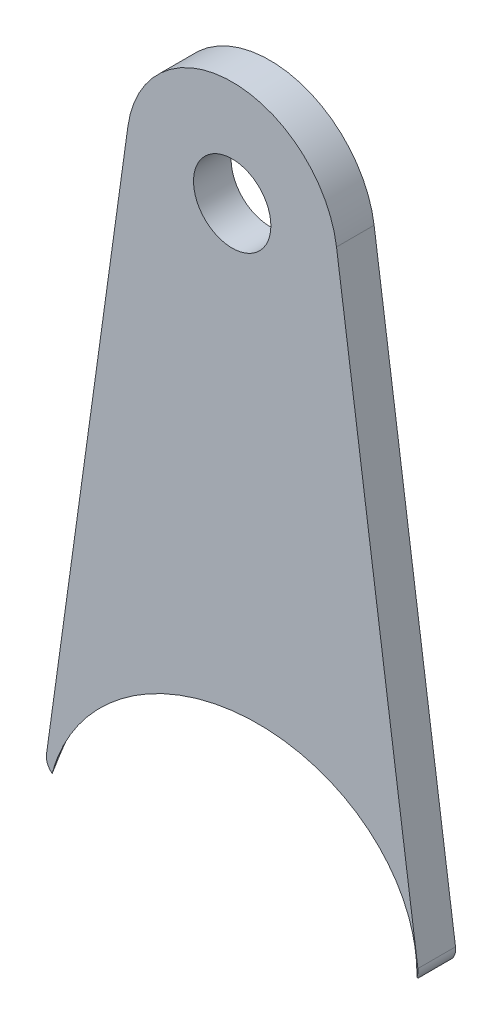
ISO-10303-21;
HEADER;
FILE_DESCRIPTION(('STEP AP214'),'2;1');
FILE_NAME('part.step','',(''),(''),'','','');
FILE_SCHEMA(('AUTOMOTIVE_DESIGN { 1 0 10303 214 1 1 1 1 }'));
ENDSEC;
DATA;
#1=APPLICATION_CONTEXT('core data for automotive mechanical design processes');
#2=APPLICATION_PROTOCOL_DEFINITION('international standard','automotive_design',2000,#1);
#3=PRODUCT_CONTEXT('',#1,'mechanical');
#4=PRODUCT('Part','Part','',(#3));
#5=PRODUCT_RELATED_PRODUCT_CATEGORY('part','',(#4));
#6=PRODUCT_DEFINITION_FORMATION('','',#4);
#7=PRODUCT_DEFINITION_CONTEXT('part definition',#1,'design');
#8=PRODUCT_DEFINITION('design','',#6,#7);
#9=PRODUCT_DEFINITION_SHAPE('','',#8);
#10=(LENGTH_UNIT() NAMED_UNIT(*) SI_UNIT(.MILLI.,.METRE.));
#11=(NAMED_UNIT(*) PLANE_ANGLE_UNIT() SI_UNIT($,.RADIAN.));
#12=(NAMED_UNIT(*) SI_UNIT($,.STERADIAN.) SOLID_ANGLE_UNIT());
#13=UNCERTAINTY_MEASURE_WITH_UNIT(LENGTH_MEASURE(1.E-05),#10,'distance_accuracy_value','');
#14=(GEOMETRIC_REPRESENTATION_CONTEXT(3) GLOBAL_UNCERTAINTY_ASSIGNED_CONTEXT((#13)) GLOBAL_UNIT_ASSIGNED_CONTEXT((#10,
#11,#12)) REPRESENTATION_CONTEXT('',''));
#15=CARTESIAN_POINT('',(0.,0.,0.));
#16=DIRECTION('',(0.,0.,1.));
#17=DIRECTION('',(1.,0.,0.));
#18=AXIS2_PLACEMENT_3D('',#15,#16,#17);
#19=CARTESIAN_POINT('',(0.,-49.53,-3.175));
#20=DIRECTION('',(0.,1.,0.));
#21=DIRECTION('',(-1.,0.,0.));
#22=AXIS2_PLACEMENT_3D('',#19,#20,#21);
#23=PLANE('',#22);
#24=CARTESIAN_POINT('',(2.2994860629505,-49.53,3.53926844532537));
#25=DIRECTION('',(0.,-1.,0.));
#26=DIRECTION('',(0.544815380436228,0.,0.838556021527559));
#27=AXIS2_PLACEMENT_3D('',#24,#25,#26);
#28=ELLIPSE('',#27,60.3015967233952,13.081);
#29=CARTESIAN_POINT('',(14.4158368159501,-49.53,-1.80692645308177));
#30=VERTEX_POINT('',#29);
#31=CARTESIAN_POINT('',(13.5360980076692,-49.53,-3.175));
#32=VERTEX_POINT('',#31);
#33=EDGE_CURVE('E152',#30,#32,#28,.F.);
#34=ORIENTED_EDGE('',*,*,#33,.T.);
#35=DIRECTION('',(1.,0.,0.));
#36=VECTOR('',#35,1.);
#37=CARTESIAN_POINT('',(0.,-49.53,-3.175));
#38=LINE('',#37,#36);
#39=CARTESIAN_POINT('',(14.4158368159501,-49.53,-3.175));
#40=VERTEX_POINT('',#39);
#41=EDGE_CURVE('E146',#32,#40,#38,.T.);
#42=ORIENTED_EDGE('',*,*,#41,.T.);
#43=DIRECTION('',(0.,0.,1.));
#44=VECTOR('',#43,1.);
#45=CARTESIAN_POINT('',(14.4158368159501,-49.53,-3.175));
#46=LINE('',#45,#44);
#47=EDGE_CURVE('E200',#30,#40,#46,.F.);
#48=ORIENTED_EDGE('',*,*,#47,.F.);
#49=EDGE_LOOP('',(#34,#42,#48));
#50=FACE_BOUND('',#49,.T.);
#51=ADVANCED_FACE('F45',(#50),#23,.F.);
#52=CARTESIAN_POINT('',(-8.80499106591057,1.22647149548415,-3.175));
#53=DIRECTION('',(-0.990437690203663,0.137960798142199,0.));
#54=DIRECTION('',(-0.1379607981422,-0.990437690203663,0.));
#55=AXIS2_PLACEMENT_3D('',#52,#53,#54);
#56=PLANE('',#55);
#57=DIRECTION('',(0.1379607981422,0.990437690203663,0.));
#58=VECTOR('',#57,1.);
#59=CARTESIAN_POINT('',(-8.80499106591057,1.22647149548415,0.));
#60=LINE('',#59,#58);
#61=CARTESIAN_POINT('',(-15.6736926825088,-48.0847897863594,0.));
#62=VERTEX_POINT('',#61);
#63=CARTESIAN_POINT('',(-8.80499106591057,1.22647149548415,0.));
#64=VERTEX_POINT('',#63);
#65=EDGE_CURVE('E111',#62,#64,#60,.T.);
#66=ORIENTED_EDGE('',*,*,#65,.T.);
#67=DIRECTION('',(0.,0.,1.));
#68=VECTOR('',#67,1.);
#69=CARTESIAN_POINT('',(-8.80499106591057,1.22647149548415,-3.175));
#70=LINE('',#69,#68);
#71=CARTESIAN_POINT('',(-8.80499106591057,1.22647149548415,-3.175));
#72=VERTEX_POINT('',#71);
#73=EDGE_CURVE('E120',#72,#64,#70,.T.);
#74=ORIENTED_EDGE('',*,*,#73,.F.);
#75=DIRECTION('',(0.1379607981422,0.990437690203663,0.));
#76=VECTOR('',#75,1.);
#77=CARTESIAN_POINT('',(-8.80499106591057,1.22647149548415,-3.175));
#78=LINE('',#77,#76);
#79=CARTESIAN_POINT('',(-15.3741347869044,-45.9342264799712,-3.175));
#80=VERTEX_POINT('',#79);
#81=EDGE_CURVE('E126',#80,#72,#78,.T.);
#82=ORIENTED_EDGE('',*,*,#81,.F.);
#83=CARTESIAN_POINT('',(-16.969769766165,-57.3894880075109,-26.1191279327687));
#84=DIRECTION('',(0.990437690203663,-0.137960798142199,0.));
#85=DIRECTION('',(0.045818832446097,0.328939084050282,0.943238948293293));
#86=AXIS2_PLACEMENT_3D('',#83,#84,#85);
#87=ELLIPSE('',#86,26.328963966994,13.081);
#88=CARTESIAN_POINT('',(-15.6736926825087,-48.0847897863594,-1.5539090575443));
#89=VERTEX_POINT('',#88);
#90=EDGE_CURVE('E148',#89,#80,#87,.F.);
#91=ORIENTED_EDGE('',*,*,#90,.F.);
#92=DIRECTION('',(0.,0.,1.));
#93=VECTOR('',#92,1.);
#94=CARTESIAN_POINT('',(-15.6736926825088,-48.0847897863594,-1.0572225503932));
#95=LINE('',#94,#93);
#96=EDGE_CURVE('E11',#62,#89,#95,.F.);
#97=ORIENTED_EDGE('',*,*,#96,.F.);
#98=EDGE_LOOP('',(#66,#74,#82,#91,#97));
#99=FACE_BOUND('',#98,.T.);
#100=ADVANCED_FACE('F129',(#99),#56,.T.);
#101=CARTESIAN_POINT('',(8.80499106591057,1.22647149548416,-3.175));
#102=DIRECTION('',(-0.990437690203663,-0.1379607981422,0.));
#103=DIRECTION('',(0.1379607981422,-0.990437690203663,0.));
#104=AXIS2_PLACEMENT_3D('',#101,#102,#103);
#105=PLANE('',#104);
#106=DIRECTION('',(-0.1379607981422,0.990437690203663,0.));
#107=VECTOR('',#106,1.);
#108=CARTESIAN_POINT('',(8.80499106591057,1.22647149548416,-3.175));
#109=LINE('',#108,#107);
#110=CARTESIAN_POINT('',(15.6736926825088,-48.0847897863594,-3.175));
#111=VERTEX_POINT('',#110);
#112=CARTESIAN_POINT('',(8.80499106591057,1.22647149548416,-3.175));
#113=VERTEX_POINT('',#112);
#114=EDGE_CURVE('E136',#111,#113,#109,.T.);
#115=ORIENTED_EDGE('',*,*,#114,.T.);
#116=DIRECTION('',(0.,0.,1.));
#117=VECTOR('',#116,1.);
#118=CARTESIAN_POINT('',(8.80499106591057,1.22647149548416,-3.175));
#119=LINE('',#118,#117);
#120=CARTESIAN_POINT('',(8.80499106591057,1.22647149548416,0.));
#121=VERTEX_POINT('',#120);
#122=EDGE_CURVE('E117',#113,#121,#119,.T.);
#123=ORIENTED_EDGE('',*,*,#122,.T.);
#124=DIRECTION('',(-0.1379607981422,0.990437690203663,0.));
#125=VECTOR('',#124,1.);
#126=CARTESIAN_POINT('',(8.80499106591057,1.22647149548416,0.));
#127=LINE('',#126,#125);
#128=CARTESIAN_POINT('',(15.6736926825088,-48.0847897863594,0.));
#129=VERTEX_POINT('',#128);
#130=EDGE_CURVE('E113',#129,#121,#127,.T.);
#131=ORIENTED_EDGE('',*,*,#130,.F.);
#132=DIRECTION('',(0.,0.,1.));
#133=VECTOR('',#132,1.);
#134=CARTESIAN_POINT('',(15.6736926825088,-48.0847897863594,-3.175));
#135=LINE('',#134,#133);
#136=EDGE_CURVE('E155',#111,#129,#135,.T.);
#137=ORIENTED_EDGE('',*,*,#136,.F.);
#138=EDGE_LOOP('',(#115,#123,#131,#137));
#139=FACE_BOUND('',#138,.T.);
#140=ADVANCED_FACE('F202',(#139),#105,.F.);
#141=CARTESIAN_POINT('',(0.,0.,-3.175));
#142=DIRECTION('',(0.,0.,1.));
#143=DIRECTION('',(-1.,0.,0.));
#144=AXIS2_PLACEMENT_3D('',#141,#142,#143);
#145=CYLINDRICAL_SURFACE('',#144,8.89);
#146=CARTESIAN_POINT('',(0.,0.,0.));
#147=DIRECTION('',(0.,0.,1.));
#148=DIRECTION('',(1.,0.,0.));
#149=AXIS2_PLACEMENT_3D('',#146,#147,#148);
#150=CIRCLE('',#149,8.89);
#151=EDGE_CURVE('E105',#121,#64,#150,.T.);
#152=ORIENTED_EDGE('',*,*,#151,.F.);
#153=ORIENTED_EDGE('',*,*,#122,.F.);
#154=CARTESIAN_POINT('',(0.,0.,-3.175));
#155=DIRECTION('',(0.,0.,1.));
#156=DIRECTION('',(1.,0.,0.));
#157=AXIS2_PLACEMENT_3D('',#154,#155,#156);
#158=CIRCLE('',#157,8.89);
#159=EDGE_CURVE('E122',#113,#72,#158,.T.);
#160=ORIENTED_EDGE('',*,*,#159,.T.);
#161=ORIENTED_EDGE('',*,*,#73,.T.);
#162=EDGE_LOOP('',(#152,#153,#160,#161));
#163=FACE_BOUND('',#162,.T.);
#164=ADVANCED_FACE('F121',(#163),#145,.T.);
#165=CARTESIAN_POINT('',(0.,0.,-3.175));
#166=DIRECTION('',(0.,0.,1.));
#167=DIRECTION('',(-1.,0.,0.));
#168=AXIS2_PLACEMENT_3D('',#165,#166,#167);
#169=CYLINDRICAL_SURFACE('',#168,3.2639);
#170=CARTESIAN_POINT('',(0.,0.,-3.175));
#171=DIRECTION('',(0.,0.,1.));
#172=DIRECTION('',(1.,0.,0.));
#173=AXIS2_PLACEMENT_3D('',#170,#171,#172);
#174=CIRCLE('',#173,3.2639);
#175=CARTESIAN_POINT('',(3.2639,0.,-3.175));
#176=VERTEX_POINT('',#175);
#177=EDGE_CURVE('E140',#176,#176,#174,.T.);
#178=ORIENTED_EDGE('',*,*,#177,.F.);
#179=EDGE_LOOP('',(#178));
#180=FACE_BOUND('',#179,.T.);
#181=CARTESIAN_POINT('',(0.,0.,0.));
#182=DIRECTION('',(0.,0.,1.));
#183=DIRECTION('',(1.,0.,0.));
#184=AXIS2_PLACEMENT_3D('',#181,#182,#183);
#185=CIRCLE('',#184,3.2639);
#186=CARTESIAN_POINT('',(3.2639,0.,0.));
#187=VERTEX_POINT('',#186);
#188=EDGE_CURVE('E131',#187,#187,#185,.T.);
#189=ORIENTED_EDGE('',*,*,#188,.T.);
#190=EDGE_LOOP('',(#189));
#191=FACE_BOUND('',#190,.T.);
#192=ADVANCED_FACE('F183',(#180,#191),#169,.F.);
#193=CARTESIAN_POINT('',(0.,0.,-3.175));
#194=DIRECTION('',(0.,0.,-1.));
#195=DIRECTION('',(1.,0.,0.));
#196=AXIS2_PLACEMENT_3D('',#193,#194,#195);
#197=PLANE('',#196);
#198=ORIENTED_EDGE('',*,*,#41,.F.);
#199=CARTESIAN_POINT('',(-2.06281845038093,-51.3092840736399,-3.17500000000001));
#200=DIRECTION('',(0.,0.,1.));
#201=DIRECTION('',(0.925940325935366,0.377669846303233,0.));
#202=AXIS2_PLACEMENT_3D('',#199,#200,#201);
#203=ELLIPSE('',#202,15.9799494969099,13.081);
#204=EDGE_CURVE('E142',#80,#32,#203,.F.);
#205=ORIENTED_EDGE('',*,*,#204,.F.);
#206=ORIENTED_EDGE('',*,*,#81,.T.);
#207=ORIENTED_EDGE('',*,*,#159,.F.);
#208=ORIENTED_EDGE('',*,*,#114,.F.);
#209=CARTESIAN_POINT('',(14.4158368159501,-48.26,-3.175));
#210=DIRECTION('',(0.,0.,1.));
#211=DIRECTION('',(1.,0.,0.));
#212=AXIS2_PLACEMENT_3D('',#209,#210,#211);
#213=CIRCLE('',#212,1.27);
#214=EDGE_CURVE('E54',#40,#111,#213,.T.);
#215=ORIENTED_EDGE('',*,*,#214,.F.);
#216=EDGE_LOOP('',(#198,#205,#206,#207,#208,#215));
#217=FACE_BOUND('',#216,.T.);
#218=ORIENTED_EDGE('',*,*,#177,.T.);
#219=EDGE_LOOP('',(#218));
#220=FACE_BOUND('',#219,.T.);
#221=ADVANCED_FACE('F185',(#217,#220),#197,.T.);
#222=CARTESIAN_POINT('',(0.,0.,0.));
#223=DIRECTION('',(0.,0.,-1.));
#224=DIRECTION('',(1.,0.,0.));
#225=AXIS2_PLACEMENT_3D('',#222,#223,#224);
#226=PLANE('',#225);
#227=ORIENTED_EDGE('',*,*,#130,.T.);
#228=ORIENTED_EDGE('',*,*,#151,.T.);
#229=ORIENTED_EDGE('',*,*,#65,.F.);
#230=CARTESIAN_POINT('',(-14.4158368159501,-48.26,0.));
#231=DIRECTION('',(0.,0.,1.));
#232=DIRECTION('',(1.,0.,0.));
#233=AXIS2_PLACEMENT_3D('',#230,#231,#232);
#234=CIRCLE('',#233,1.27);
#235=CARTESIAN_POINT('',(-15.1921396181959,-49.2651139036073,0.));
#236=VERTEX_POINT('',#235);
#237=EDGE_CURVE('E160',#236,#62,#234,.F.);
#238=ORIENTED_EDGE('',*,*,#237,.F.);
#239=CARTESIAN_POINT('',(0.,-50.4679076854587,0.));
#240=DIRECTION('',(0.,0.,1.));
#241=DIRECTION('',(0.925940325935366,0.377669846303233,0.));
#242=AXIS2_PLACEMENT_3D('',#239,#240,#241);
#243=ELLIPSE('',#242,15.9799494969099,13.081);
#244=CARTESIAN_POINT('',(15.5985429736099,-48.7227160518423,0.));
#245=VERTEX_POINT('',#244);
#246=EDGE_CURVE('E134',#236,#245,#243,.F.);
#247=ORIENTED_EDGE('',*,*,#246,.T.);
#248=CARTESIAN_POINT('',(14.4158368159501,-48.26,0.));
#249=DIRECTION('',(0.,0.,1.));
#250=DIRECTION('',(1.,0.,0.));
#251=AXIS2_PLACEMENT_3D('',#248,#249,#250);
#252=CIRCLE('',#251,1.27);
#253=EDGE_CURVE('E162',#129,#245,#252,.F.);
#254=ORIENTED_EDGE('',*,*,#253,.F.);
#255=EDGE_LOOP('',(#227,#228,#229,#238,#247,#254));
#256=FACE_BOUND('',#255,.T.);
#257=ORIENTED_EDGE('',*,*,#188,.F.);
#258=EDGE_LOOP('',(#257));
#259=FACE_BOUND('',#258,.T.);
#260=ADVANCED_FACE('F107',(#256,#259),#226,.F.);
#261=CARTESIAN_POINT('',(-123.025911317866,-100.647358474361,-189.356105653459));
#262=DIRECTION('',(0.53184223249345,0.216926262500193,0.818588319226509));
#263=DIRECTION('',(0.455152304592378,0.74192435650579,-0.492325734496701));
#264=AXIS2_PLACEMENT_3D('',#261,#262,#263);
#265=CYLINDRICAL_SURFACE('',#264,13.081);
#266=ORIENTED_EDGE('',*,*,#246,.F.);
#267=CARTESIAN_POINT('',(-15.6736926825088,-48.0847897863594,-1.5539090575443));
#268=CARTESIAN_POINT('',(-15.6784371873488,-48.1189182486166,-1.53739528471204));
#269=CARTESIAN_POINT('',(-15.6816774422343,-48.1522733293865,-1.51905950509594));
#270=CARTESIAN_POINT('',(-15.6855345205484,-48.217242966715,-1.47953256215171));
#271=CARTESIAN_POINT('',(-15.6861615240902,-48.2488638028561,-1.45835281141609));
#272=CARTESIAN_POINT('',(-15.685214535185,-48.3100177997879,-1.41409105300173));
#273=CARTESIAN_POINT('',(-15.6836704913902,-48.339573577939,-1.39103898224994));
#274=CARTESIAN_POINT('',(-15.6787402784425,-48.3971509957232,-1.34322278880819));
#275=CARTESIAN_POINT('',(-15.6753518612579,-48.4251707171503,-1.31845660908041));
#276=CARTESIAN_POINT('',(-15.664703311819,-48.4946443086468,-1.25367683114387));
#277=CARTESIAN_POINT('',(-15.6563391925421,-48.5350625082218,-1.21273343201252));
#278=CARTESIAN_POINT('',(-15.63655485712,-48.6126269487979,-1.12859018387614));
#279=CARTESIAN_POINT('',(-15.6251338169207,-48.6497723039441,-1.08538972896741));
#280=CARTESIAN_POINT('',(-15.586927284624,-48.7572741468586,-0.952679383978724));
#281=CARTESIAN_POINT('',(-15.5563009606304,-48.8231374985494,-0.860607238989399));
#282=CARTESIAN_POINT('',(-15.4999952176118,-48.9229485168676,-0.706151824406168));
#283=CARTESIAN_POINT('',(-15.4764298616952,-48.95991649861,-0.644854778866204));
#284=CARTESIAN_POINT('',(-15.4268438855107,-49.0298021732178,-0.521276921483469));
#285=CARTESIAN_POINT('',(-15.4008326082607,-49.0627342540003,-0.459000553740695));
#286=CARTESIAN_POINT('',(-15.3455804076619,-49.1262103339143,-0.331030142560507));
#287=CARTESIAN_POINT('',(-15.3162512645523,-49.1566032193919,-0.26529995447097));
#288=CARTESIAN_POINT('',(-15.2556058721674,-49.2136295689042,-0.133126844828515));
#289=CARTESIAN_POINT('',(-15.2242896526172,-49.2402630891568,-0.0666839339497221));
#290=CARTESIAN_POINT('',(-15.1921396181959,-49.2651139036076,0.));
#291=B_SPLINE_CURVE_WITH_KNOTS('',3,(#267,#268,#269,#270,#271,#272,#273,#274,#275,#276,#277,
#278,#279,#280,#281,#282,#283,#284,#285,#286,#287,#288,#289,#290),.UNSPECIFIED.,.F.,.F.,(4,2,2,
2,2,2,2,2,2,2,2,4),(0.,0.11441815239697,0.228390161430213,0.340805310577415,0.453357785795617,
0.627479059623634,0.801647318685721,1.15232504866078,1.37829256700999,1.60342951232398,
1.83770139576616,2.07196977550959),.UNSPECIFIED.);
#292=EDGE_CURVE('E164',#89,#236,#291,.T.);
#293=ORIENTED_EDGE('',*,*,#292,.F.);
#294=ORIENTED_EDGE('',*,*,#90,.T.);
#295=ORIENTED_EDGE('',*,*,#204,.T.);
#296=ORIENTED_EDGE('',*,*,#33,.F.);
#297=CARTESIAN_POINT('',(15.5985429736099,-48.7227160518423,0.));
#298=CARTESIAN_POINT('',(15.5849790204181,-48.7573635317885,-0.0203132637619774));
#299=CARTESIAN_POINT('',(15.5702702725225,-48.7904982878316,-0.0422630231941841));
#300=CARTESIAN_POINT('',(15.5390390928713,-48.8537683443206,-0.0888037029788457));
#301=CARTESIAN_POINT('',(15.5225224272394,-48.8839126281046,-0.113386221365028));
#302=CARTESIAN_POINT('',(15.4713827240308,-48.9692852503763,-0.189526644875624));
#303=CARTESIAN_POINT('',(15.4347094328253,-49.0205485510728,-0.244162013928613));
#304=CARTESIAN_POINT('',(15.3675086701183,-49.1021912720567,-0.344608237806992));
#305=CARTESIAN_POINT('',(15.3376779172553,-49.1346097582723,-0.389299895221282));
#306=CARTESIAN_POINT('',(15.2766900123256,-49.1946997899512,-0.480934929943017));
#307=CARTESIAN_POINT('',(15.2455325099741,-49.2223700719852,-0.52787890232056));
#308=CARTESIAN_POINT('',(15.1818652706526,-49.2738042061087,-0.624095964982873));
#309=CARTESIAN_POINT('',(15.1493426463507,-49.2975073251745,-0.673392595283158));
#310=CARTESIAN_POINT('',(15.0836418244414,-49.3409656938364,-0.773280503426007));
#311=CARTESIAN_POINT('',(15.0504634312017,-49.3607197451807,-0.823872168979782));
#312=CARTESIAN_POINT('',(14.9671082722622,-49.4055219883027,-0.951339703033563));
#313=CARTESIAN_POINT('',(14.9166541024208,-49.4283440167743,-1.02881913398424));
#314=CARTESIAN_POINT('',(14.8151840219039,-49.4667989021394,-1.18522476957983));
#315=CARTESIAN_POINT('',(14.7641677330781,-49.482426573178,-1.26415197533348));
#316=CARTESIAN_POINT('',(14.663566701693,-49.5066449380434,-1.42026640254791));
#317=CARTESIAN_POINT('',(14.6139897732254,-49.5154492653154,-1.49742599171148));
#318=CARTESIAN_POINT('',(14.5148678008087,-49.5271053508344,-1.65202775484731));
#319=CARTESIAN_POINT('',(14.4653228509545,-49.5299674177491,-1.7294692055735));
#320=CARTESIAN_POINT('',(14.4158368159501,-49.53,-1.80692645308178));
#321=B_SPLINE_CURVE_WITH_KNOTS('',3,(#297,#298,#299,#300,#301,#302,#303,#304,#305,#306,#307,
#308,#309,#310,#311,#312,#313,#314,#315,#316,#317,#318,#319,#320),.UNSPECIFIED.,.F.,.F.,(4,2,2,
2,2,2,2,2,2,2,2,4),(0.,0.126969423952243,0.253545085869525,0.50264783481766,0.690696607780068,
0.87879534050691,1.0695523338275,1.26036712031519,1.54572248674464,1.83128322291413,
2.10749497453335,2.38322715065447),.UNSPECIFIED.);
#322=EDGE_CURVE('E67',#245,#30,#321,.T.);
#323=ORIENTED_EDGE('',*,*,#322,.F.);
#324=EDGE_LOOP('',(#266,#293,#294,#295,#296,#323));
#325=FACE_BOUND('',#324,.T.);
#326=ADVANCED_FACE('F176',(#325),#265,.F.);
#327=CARTESIAN_POINT('',(14.4158368159501,-48.26,-3.175));
#328=DIRECTION('',(0.,0.,1.));
#329=DIRECTION('',(-1.,0.,0.));
#330=AXIS2_PLACEMENT_3D('',#327,#328,#329);
#331=CYLINDRICAL_SURFACE('',#330,1.27);
#332=ORIENTED_EDGE('',*,*,#214,.T.);
#333=ORIENTED_EDGE('',*,*,#136,.T.);
#334=ORIENTED_EDGE('',*,*,#253,.T.);
#335=ORIENTED_EDGE('',*,*,#322,.T.);
#336=ORIENTED_EDGE('',*,*,#47,.T.);
#337=EDGE_LOOP('',(#332,#333,#334,#335,#336));
#338=FACE_BOUND('',#337,.T.);
#339=ADVANCED_FACE('F181',(#338),#331,.T.);
#340=CARTESIAN_POINT('',(-14.4158368159501,-48.26,-3.175));
#341=DIRECTION('',(0.,0.,-1.));
#342=DIRECTION('',(1.,0.,0.));
#343=AXIS2_PLACEMENT_3D('',#340,#341,#342);
#344=CYLINDRICAL_SURFACE('',#343,1.27);
#345=ORIENTED_EDGE('',*,*,#292,.T.);
#346=ORIENTED_EDGE('',*,*,#237,.T.);
#347=ORIENTED_EDGE('',*,*,#96,.T.);
#348=EDGE_LOOP('',(#345,#346,#347));
#349=FACE_BOUND('',#348,.T.);
#350=ADVANCED_FACE('F47',(#349),#344,.T.);
#351=CLOSED_SHELL('',(#51,#100,#140,#164,#192,#221,#260,#326,#339,#350));
#352=MANIFOLD_SOLID_BREP('B2',#351);
#353=ADVANCED_BREP_SHAPE_REPRESENTATION('',(#18,#352),#14);
#354=SHAPE_DEFINITION_REPRESENTATION(#9,#353);
ENDSEC;
END-ISO-10303-21;
